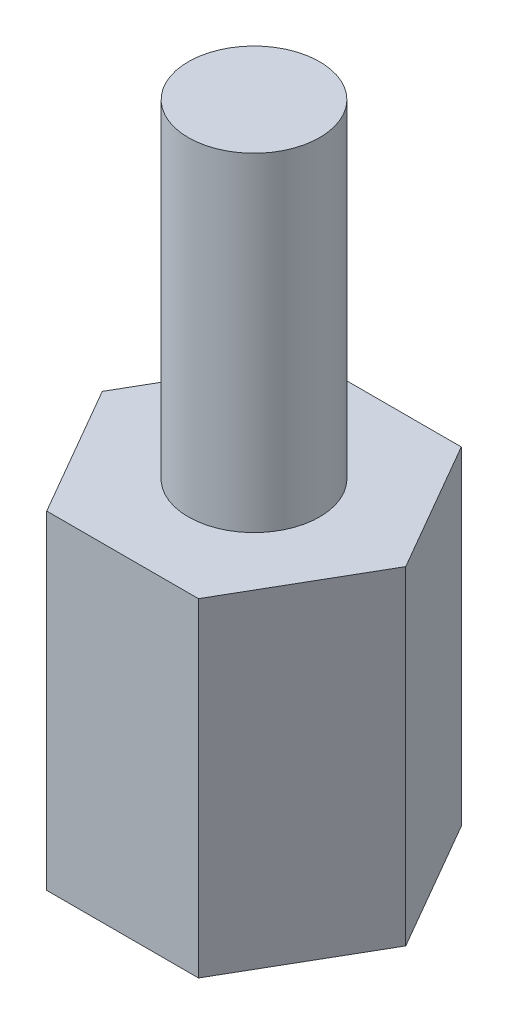
ISO-10303-21;
HEADER;
FILE_DESCRIPTION(('STEP AP214'),'2;1');
FILE_NAME('part.step','',(''),(''),'','','');
FILE_SCHEMA(('AUTOMOTIVE_DESIGN { 1 0 10303 214 1 1 1 1 }'));
ENDSEC;
DATA;
#1=APPLICATION_CONTEXT('core data for automotive mechanical design processes');
#2=APPLICATION_PROTOCOL_DEFINITION('international standard','automotive_design',2000,#1);
#3=PRODUCT_CONTEXT('',#1,'mechanical');
#4=PRODUCT('Part','Part','',(#3));
#5=PRODUCT_RELATED_PRODUCT_CATEGORY('part','',(#4));
#6=PRODUCT_DEFINITION_FORMATION('','',#4);
#7=PRODUCT_DEFINITION_CONTEXT('part definition',#1,'design');
#8=PRODUCT_DEFINITION('design','',#6,#7);
#9=PRODUCT_DEFINITION_SHAPE('','',#8);
#10=(LENGTH_UNIT() NAMED_UNIT(*) SI_UNIT(.MILLI.,.METRE.));
#11=(NAMED_UNIT(*) PLANE_ANGLE_UNIT() SI_UNIT($,.RADIAN.));
#12=(NAMED_UNIT(*) SI_UNIT($,.STERADIAN.) SOLID_ANGLE_UNIT());
#13=UNCERTAINTY_MEASURE_WITH_UNIT(LENGTH_MEASURE(1.E-05),#10,'distance_accuracy_value','');
#14=(GEOMETRIC_REPRESENTATION_CONTEXT(3) GLOBAL_UNCERTAINTY_ASSIGNED_CONTEXT((#13)) GLOBAL_UNIT_ASSIGNED_CONTEXT((#10,
#11,#12)) REPRESENTATION_CONTEXT('',''));
#15=CARTESIAN_POINT('',(0.,0.,0.));
#16=DIRECTION('',(0.,0.,1.));
#17=DIRECTION('',(1.,0.,0.));
#18=AXIS2_PLACEMENT_3D('',#15,#16,#17);
#19=CARTESIAN_POINT('',(0.,5.,0.));
#20=DIRECTION('',(0.,-1.,0.));
#21=DIRECTION('',(0.,0.,-1.));
#22=AXIS2_PLACEMENT_3D('',#19,#20,#21);
#23=CYLINDRICAL_SURFACE('',#22,1.);
#24=CARTESIAN_POINT('',(0.,5.,0.));
#25=DIRECTION('',(0.,1.,0.));
#26=DIRECTION('',(0.,0.,1.));
#27=AXIS2_PLACEMENT_3D('',#24,#25,#26);
#28=CIRCLE('',#27,1.);
#29=CARTESIAN_POINT('',(0.,5.,1.));
#30=VERTEX_POINT('',#29);
#31=EDGE_CURVE('E11',#30,#30,#28,.T.);
#32=ORIENTED_EDGE('',*,*,#31,.F.);
#33=EDGE_LOOP('',(#32));
#34=FACE_BOUND('',#33,.T.);
#35=CARTESIAN_POINT('',(0.,0.,0.));
#36=DIRECTION('',(0.,1.,0.));
#37=DIRECTION('',(0.,0.,1.));
#38=AXIS2_PLACEMENT_3D('',#35,#36,#37);
#39=CIRCLE('',#38,1.);
#40=CARTESIAN_POINT('',(0.,0.,1.));
#41=VERTEX_POINT('',#40);
#42=EDGE_CURVE('E45',#41,#41,#39,.T.);
#43=ORIENTED_EDGE('',*,*,#42,.T.);
#44=EDGE_LOOP('',(#43));
#45=FACE_BOUND('',#44,.T.);
#46=ADVANCED_FACE('F39',(#34,#45),#23,.T.);
#47=CARTESIAN_POINT('',(0.,5.,0.));
#48=DIRECTION('',(0.,1.,0.));
#49=DIRECTION('',(0.,0.,1.));
#50=AXIS2_PLACEMENT_3D('',#47,#48,#49);
#51=PLANE('',#50);
#52=ORIENTED_EDGE('',*,*,#31,.T.);
#53=EDGE_LOOP('',(#52));
#54=FACE_BOUND('',#53,.T.);
#55=ADVANCED_FACE('F161',(#54),#51,.T.);
#56=CARTESIAN_POINT('',(1.15470053837925,-5.,2.));
#57=DIRECTION('',(0.866025403784439,0.,0.5));
#58=DIRECTION('',(0.5,0.,-0.866025403784439));
#59=AXIS2_PLACEMENT_3D('',#56,#57,#58);
#60=PLANE('',#59);
#61=DIRECTION('',(0.5,0.,-0.866025403784439));
#62=VECTOR('',#61,1.);
#63=CARTESIAN_POINT('',(1.15470053837925,0.,2.));
#64=LINE('',#63,#62);
#65=CARTESIAN_POINT('',(1.15470053837925,0.,2.));
#66=VERTEX_POINT('',#65);
#67=CARTESIAN_POINT('',(2.3094010767585,0.,0.));
#68=VERTEX_POINT('',#67);
#69=EDGE_CURVE('E127',#66,#68,#64,.T.);
#70=ORIENTED_EDGE('',*,*,#69,.F.);
#71=DIRECTION('',(0.,1.,0.));
#72=VECTOR('',#71,1.);
#73=CARTESIAN_POINT('',(1.15470053837925,-5.,2.));
#74=LINE('',#73,#72);
#75=CARTESIAN_POINT('',(1.15470053837925,-5.,2.));
#76=VERTEX_POINT('',#75);
#77=EDGE_CURVE('E54',#76,#66,#74,.T.);
#78=ORIENTED_EDGE('',*,*,#77,.F.);
#79=DIRECTION('',(0.5,0.,-0.866025403784439));
#80=VECTOR('',#79,1.);
#81=CARTESIAN_POINT('',(1.15470053837925,-5.,2.));
#82=LINE('',#81,#80);
#83=CARTESIAN_POINT('',(2.3094010767585,-5.,0.));
#84=VERTEX_POINT('',#83);
#85=EDGE_CURVE('E142',#76,#84,#82,.T.);
#86=ORIENTED_EDGE('',*,*,#85,.T.);
#87=DIRECTION('',(0.,1.,0.));
#88=VECTOR('',#87,1.);
#89=CARTESIAN_POINT('',(2.3094010767585,-5.,0.));
#90=LINE('',#89,#88);
#91=EDGE_CURVE('E89',#84,#68,#90,.T.);
#92=ORIENTED_EDGE('',*,*,#91,.T.);
#93=EDGE_LOOP('',(#70,#78,#86,#92));
#94=FACE_BOUND('',#93,.T.);
#95=ADVANCED_FACE('F146',(#94),#60,.T.);
#96=CARTESIAN_POINT('',(-1.15470053837925,-5.,2.));
#97=DIRECTION('',(0.,0.,1.));
#98=DIRECTION('',(1.,0.,0.));
#99=AXIS2_PLACEMENT_3D('',#96,#97,#98);
#100=PLANE('',#99);
#101=DIRECTION('',(1.,0.,0.));
#102=VECTOR('',#101,1.);
#103=CARTESIAN_POINT('',(-1.15470053837925,0.,2.));
#104=LINE('',#103,#102);
#105=CARTESIAN_POINT('',(-1.15470053837925,0.,2.));
#106=VERTEX_POINT('',#105);
#107=EDGE_CURVE('E136',#106,#66,#104,.T.);
#108=ORIENTED_EDGE('',*,*,#107,.F.);
#109=DIRECTION('',(0.,1.,0.));
#110=VECTOR('',#109,1.);
#111=CARTESIAN_POINT('',(-1.15470053837925,-5.,2.));
#112=LINE('',#111,#110);
#113=CARTESIAN_POINT('',(-1.15470053837925,-5.,2.));
#114=VERTEX_POINT('',#113);
#115=EDGE_CURVE('E79',#114,#106,#112,.T.);
#116=ORIENTED_EDGE('',*,*,#115,.F.);
#117=DIRECTION('',(1.,0.,0.));
#118=VECTOR('',#117,1.);
#119=CARTESIAN_POINT('',(-1.15470053837925,-5.,2.));
#120=LINE('',#119,#118);
#121=EDGE_CURVE('E117',#114,#76,#120,.T.);
#122=ORIENTED_EDGE('',*,*,#121,.T.);
#123=ORIENTED_EDGE('',*,*,#77,.T.);
#124=EDGE_LOOP('',(#108,#116,#122,#123));
#125=FACE_BOUND('',#124,.T.);
#126=ADVANCED_FACE('F153',(#125),#100,.T.);
#127=CARTESIAN_POINT('',(-2.3094010767585,-5.,0.));
#128=DIRECTION('',(-0.866025403784438,0.,0.5));
#129=DIRECTION('',(0.5,0.,0.866025403784439));
#130=AXIS2_PLACEMENT_3D('',#127,#128,#129);
#131=PLANE('',#130);
#132=DIRECTION('',(0.5,0.,0.866025403784439));
#133=VECTOR('',#132,1.);
#134=CARTESIAN_POINT('',(-2.3094010767585,0.,0.));
#135=LINE('',#134,#133);
#136=CARTESIAN_POINT('',(-2.3094010767585,0.,0.));
#137=VERTEX_POINT('',#136);
#138=EDGE_CURVE('E103',#137,#106,#135,.T.);
#139=ORIENTED_EDGE('',*,*,#138,.F.);
#140=DIRECTION('',(0.,1.,0.));
#141=VECTOR('',#140,1.);
#142=CARTESIAN_POINT('',(-2.3094010767585,-5.,0.));
#143=LINE('',#142,#141);
#144=CARTESIAN_POINT('',(-2.3094010767585,-5.,0.));
#145=VERTEX_POINT('',#144);
#146=EDGE_CURVE('E98',#145,#137,#143,.T.);
#147=ORIENTED_EDGE('',*,*,#146,.F.);
#148=DIRECTION('',(0.5,0.,0.866025403784439));
#149=VECTOR('',#148,1.);
#150=CARTESIAN_POINT('',(-2.3094010767585,-5.,0.));
#151=LINE('',#150,#149);
#152=EDGE_CURVE('E101',#145,#114,#151,.T.);
#153=ORIENTED_EDGE('',*,*,#152,.T.);
#154=ORIENTED_EDGE('',*,*,#115,.T.);
#155=EDGE_LOOP('',(#139,#147,#153,#154));
#156=FACE_BOUND('',#155,.T.);
#157=ADVANCED_FACE('F99',(#156),#131,.T.);
#158=CARTESIAN_POINT('',(-1.15470053837925,-5.,-2.));
#159=DIRECTION('',(-0.866025403784439,0.,-0.5));
#160=DIRECTION('',(-0.5,0.,0.866025403784439));
#161=AXIS2_PLACEMENT_3D('',#158,#159,#160);
#162=PLANE('',#161);
#163=DIRECTION('',(-0.5,0.,0.866025403784439));
#164=VECTOR('',#163,1.);
#165=CARTESIAN_POINT('',(-1.15470053837925,0.,-2.));
#166=LINE('',#165,#164);
#167=CARTESIAN_POINT('',(-1.15470053837925,0.,-2.));
#168=VERTEX_POINT('',#167);
#169=EDGE_CURVE('E137',#168,#137,#166,.T.);
#170=ORIENTED_EDGE('',*,*,#169,.F.);
#171=DIRECTION('',(0.,1.,0.));
#172=VECTOR('',#171,1.);
#173=CARTESIAN_POINT('',(-1.15470053837925,-5.,-2.));
#174=LINE('',#173,#172);
#175=CARTESIAN_POINT('',(-1.15470053837925,-5.,-2.));
#176=VERTEX_POINT('',#175);
#177=EDGE_CURVE('E107',#176,#168,#174,.T.);
#178=ORIENTED_EDGE('',*,*,#177,.F.);
#179=DIRECTION('',(-0.5,0.,0.866025403784439));
#180=VECTOR('',#179,1.);
#181=CARTESIAN_POINT('',(-1.15470053837925,-5.,-2.));
#182=LINE('',#181,#180);
#183=EDGE_CURVE('E111',#176,#145,#182,.T.);
#184=ORIENTED_EDGE('',*,*,#183,.T.);
#185=ORIENTED_EDGE('',*,*,#146,.T.);
#186=EDGE_LOOP('',(#170,#178,#184,#185));
#187=FACE_BOUND('',#186,.T.);
#188=ADVANCED_FACE('F119',(#187),#162,.T.);
#189=CARTESIAN_POINT('',(1.15470053837925,-5.,-2.));
#190=DIRECTION('',(0.,0.,-1.));
#191=DIRECTION('',(-1.,0.,0.));
#192=AXIS2_PLACEMENT_3D('',#189,#190,#191);
#193=PLANE('',#192);
#194=DIRECTION('',(-1.,0.,0.));
#195=VECTOR('',#194,1.);
#196=CARTESIAN_POINT('',(1.15470053837925,0.,-2.));
#197=LINE('',#196,#195);
#198=CARTESIAN_POINT('',(1.15470053837925,0.,-2.));
#199=VERTEX_POINT('',#198);
#200=EDGE_CURVE('E134',#199,#168,#197,.T.);
#201=ORIENTED_EDGE('',*,*,#200,.F.);
#202=DIRECTION('',(0.,1.,0.));
#203=VECTOR('',#202,1.);
#204=CARTESIAN_POINT('',(1.15470053837925,-5.,-2.));
#205=LINE('',#204,#203);
#206=CARTESIAN_POINT('',(1.15470053837925,-5.,-2.));
#207=VERTEX_POINT('',#206);
#208=EDGE_CURVE('E148',#207,#199,#205,.T.);
#209=ORIENTED_EDGE('',*,*,#208,.F.);
#210=DIRECTION('',(-1.,0.,0.));
#211=VECTOR('',#210,1.);
#212=CARTESIAN_POINT('',(1.15470053837925,-5.,-2.));
#213=LINE('',#212,#211);
#214=EDGE_CURVE('E116',#207,#176,#213,.T.);
#215=ORIENTED_EDGE('',*,*,#214,.T.);
#216=ORIENTED_EDGE('',*,*,#177,.T.);
#217=EDGE_LOOP('',(#201,#209,#215,#216));
#218=FACE_BOUND('',#217,.T.);
#219=ADVANCED_FACE('F199',(#218),#193,.T.);
#220=CARTESIAN_POINT('',(2.3094010767585,-5.,0.));
#221=DIRECTION('',(0.866025403784438,0.,-0.5));
#222=DIRECTION('',(-0.5,0.,-0.866025403784439));
#223=AXIS2_PLACEMENT_3D('',#220,#221,#222);
#224=PLANE('',#223);
#225=DIRECTION('',(-0.5,0.,-0.866025403784439));
#226=VECTOR('',#225,1.);
#227=CARTESIAN_POINT('',(2.3094010767585,0.,0.));
#228=LINE('',#227,#226);
#229=EDGE_CURVE('E129',#68,#199,#228,.T.);
#230=ORIENTED_EDGE('',*,*,#229,.F.);
#231=ORIENTED_EDGE('',*,*,#91,.F.);
#232=DIRECTION('',(-0.5,0.,-0.866025403784439));
#233=VECTOR('',#232,1.);
#234=CARTESIAN_POINT('',(2.3094010767585,-5.,0.));
#235=LINE('',#234,#233);
#236=EDGE_CURVE('E122',#84,#207,#235,.T.);
#237=ORIENTED_EDGE('',*,*,#236,.T.);
#238=ORIENTED_EDGE('',*,*,#208,.T.);
#239=EDGE_LOOP('',(#230,#231,#237,#238));
#240=FACE_BOUND('',#239,.T.);
#241=ADVANCED_FACE('F149',(#240),#224,.T.);
#242=CARTESIAN_POINT('',(0.,-5.,0.));
#243=DIRECTION('',(0.,1.,0.));
#244=DIRECTION('',(0.,0.,1.));
#245=AXIS2_PLACEMENT_3D('',#242,#243,#244);
#246=PLANE('',#245);
#247=CARTESIAN_POINT('',(0.,-5.,0.));
#248=DIRECTION('',(0.,-1.,0.));
#249=DIRECTION('',(0.,0.,-1.));
#250=AXIS2_PLACEMENT_3D('',#247,#248,#249);
#251=CIRCLE('',#250,1.);
#252=CARTESIAN_POINT('',(0.,-5.,-1.));
#253=VERTEX_POINT('',#252);
#254=EDGE_CURVE('E191',#253,#253,#251,.T.);
#255=ORIENTED_EDGE('',*,*,#254,.F.);
#256=EDGE_LOOP('',(#255));
#257=FACE_BOUND('',#256,.T.);
#258=ORIENTED_EDGE('',*,*,#85,.F.);
#259=ORIENTED_EDGE('',*,*,#121,.F.);
#260=ORIENTED_EDGE('',*,*,#152,.F.);
#261=ORIENTED_EDGE('',*,*,#183,.F.);
#262=ORIENTED_EDGE('',*,*,#214,.F.);
#263=ORIENTED_EDGE('',*,*,#236,.F.);
#264=EDGE_LOOP('',(#258,#259,#260,#261,#262,#263));
#265=FACE_BOUND('',#264,.T.);
#266=ADVANCED_FACE('F115',(#257,#265),#246,.F.);
#267=CARTESIAN_POINT('',(0.,0.,0.));
#268=DIRECTION('',(0.,1.,0.));
#269=DIRECTION('',(0.,0.,1.));
#270=AXIS2_PLACEMENT_3D('',#267,#268,#269);
#271=PLANE('',#270);
#272=ORIENTED_EDGE('',*,*,#42,.F.);
#273=EDGE_LOOP('',(#272));
#274=FACE_BOUND('',#273,.T.);
#275=ORIENTED_EDGE('',*,*,#69,.T.);
#276=ORIENTED_EDGE('',*,*,#229,.T.);
#277=ORIENTED_EDGE('',*,*,#200,.T.);
#278=ORIENTED_EDGE('',*,*,#169,.T.);
#279=ORIENTED_EDGE('',*,*,#138,.T.);
#280=ORIENTED_EDGE('',*,*,#107,.T.);
#281=EDGE_LOOP('',(#275,#276,#277,#278,#279,#280));
#282=FACE_BOUND('',#281,.T.);
#283=ADVANCED_FACE('F155',(#274,#282),#271,.T.);
#284=CARTESIAN_POINT('',(0.,-2.,0.));
#285=DIRECTION('',(0.,-1.,0.));
#286=DIRECTION('',(0.,0.,-1.));
#287=AXIS2_PLACEMENT_3D('',#284,#285,#286);
#288=CYLINDRICAL_SURFACE('',#287,1.);
#289=CARTESIAN_POINT('',(0.,-2.,0.));
#290=DIRECTION('',(0.,-1.,0.));
#291=DIRECTION('',(0.,0.,-1.));
#292=AXIS2_PLACEMENT_3D('',#289,#290,#291);
#293=CIRCLE('',#292,1.);
#294=CARTESIAN_POINT('',(0.,-2.,-1.));
#295=VERTEX_POINT('',#294);
#296=EDGE_CURVE('E128',#295,#295,#293,.T.);
#297=ORIENTED_EDGE('',*,*,#296,.F.);
#298=EDGE_LOOP('',(#297));
#299=FACE_BOUND('',#298,.T.);
#300=ORIENTED_EDGE('',*,*,#254,.T.);
#301=EDGE_LOOP('',(#300));
#302=FACE_BOUND('',#301,.T.);
#303=ADVANCED_FACE('F177',(#299,#302),#288,.F.);
#304=CARTESIAN_POINT('',(0.,-2.,0.));
#305=DIRECTION('',(0.,-1.,0.));
#306=DIRECTION('',(0.,0.,-1.));
#307=AXIS2_PLACEMENT_3D('',#304,#305,#306);
#308=PLANE('',#307);
#309=ORIENTED_EDGE('',*,*,#296,.T.);
#310=EDGE_LOOP('',(#309));
#311=FACE_BOUND('',#310,.T.);
#312=ADVANCED_FACE('F185',(#311),#308,.T.);
#313=CLOSED_SHELL('',(#46,#55,#95,#126,#157,#188,#219,#241,#266,#283,#303,#312));
#314=MANIFOLD_SOLID_BREP('B2',#313);
#315=ADVANCED_BREP_SHAPE_REPRESENTATION('',(#18,#314),#14);
#316=SHAPE_DEFINITION_REPRESENTATION(#9,#315);
ENDSEC;
END-ISO-10303-21;
